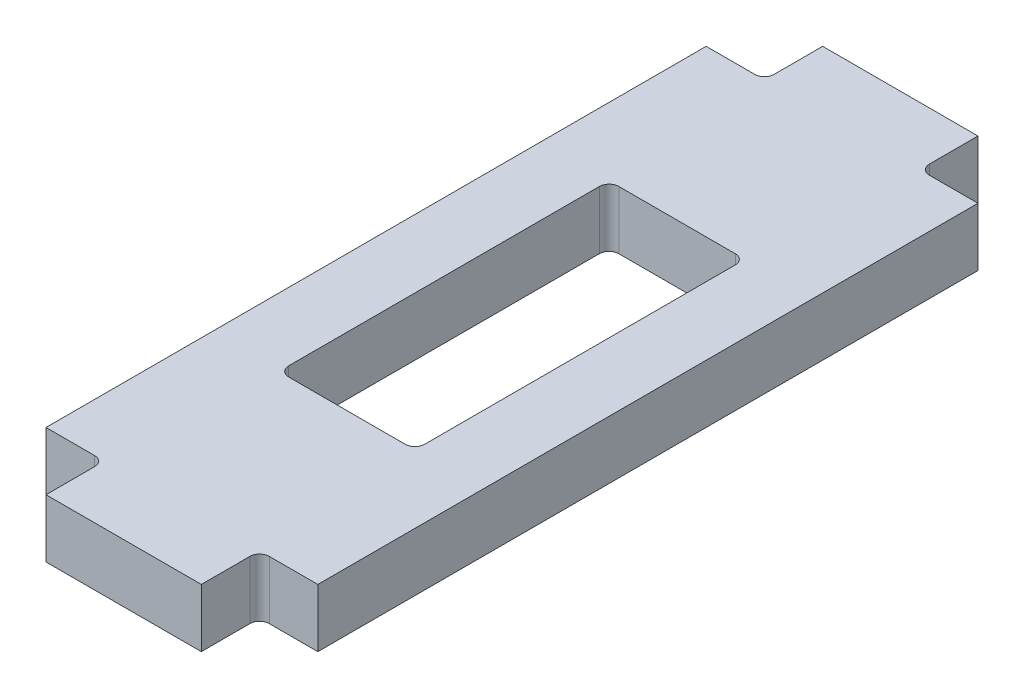
ISO-10303-21;
HEADER;
FILE_DESCRIPTION(('STEP AP214'),'2;1');
FILE_NAME('part.step','',(''),(''),'','','');
FILE_SCHEMA(('AUTOMOTIVE_DESIGN { 1 0 10303 214 1 1 1 1 }'));
ENDSEC;
DATA;
#1=APPLICATION_CONTEXT('core data for automotive mechanical design processes');
#2=APPLICATION_PROTOCOL_DEFINITION('international standard','automotive_design',2000,#1);
#3=PRODUCT_CONTEXT('',#1,'mechanical');
#4=PRODUCT('Part','Part','',(#3));
#5=PRODUCT_RELATED_PRODUCT_CATEGORY('part','',(#4));
#6=PRODUCT_DEFINITION_FORMATION('','',#4);
#7=PRODUCT_DEFINITION_CONTEXT('part definition',#1,'design');
#8=PRODUCT_DEFINITION('design','',#6,#7);
#9=PRODUCT_DEFINITION_SHAPE('','',#8);
#10=(LENGTH_UNIT() NAMED_UNIT(*) SI_UNIT(.MILLI.,.METRE.));
#11=(NAMED_UNIT(*) PLANE_ANGLE_UNIT() SI_UNIT($,.RADIAN.));
#12=(NAMED_UNIT(*) SI_UNIT($,.STERADIAN.) SOLID_ANGLE_UNIT());
#13=UNCERTAINTY_MEASURE_WITH_UNIT(LENGTH_MEASURE(1.E-05),#10,'distance_accuracy_value','');
#14=(GEOMETRIC_REPRESENTATION_CONTEXT(3) GLOBAL_UNCERTAINTY_ASSIGNED_CONTEXT((#13)) GLOBAL_UNIT_ASSIGNED_CONTEXT((#10,
#11,#12)) REPRESENTATION_CONTEXT('',''));
#15=CARTESIAN_POINT('',(0.,0.,0.));
#16=DIRECTION('',(0.,0.,1.));
#17=DIRECTION('',(1.,0.,0.));
#18=AXIS2_PLACEMENT_3D('',#15,#16,#17);
#19=CARTESIAN_POINT('',(0.,3.,-8.5));
#20=DIRECTION('',(0.,0.,-1.));
#21=DIRECTION('',(-1.,0.,0.));
#22=AXIS2_PLACEMENT_3D('',#19,#20,#21);
#23=PLANE('',#22);
#24=DIRECTION('',(1.,0.,0.));
#25=VECTOR('',#24,1.);
#26=CARTESIAN_POINT('',(0.,0.,-8.5));
#27=LINE('',#26,#25);
#28=CARTESIAN_POINT('',(-3.,0.,-8.5));
#29=VERTEX_POINT('',#28);
#30=CARTESIAN_POINT('',(3.,0.,-8.5));
#31=VERTEX_POINT('',#30);
#32=EDGE_CURVE('E289',#29,#31,#27,.T.);
#33=ORIENTED_EDGE('',*,*,#32,.T.);
#34=DIRECTION('',(0.,-1.,0.));
#35=VECTOR('',#34,1.);
#36=CARTESIAN_POINT('',(3.,3.,-8.5));
#37=LINE('',#36,#35);
#38=CARTESIAN_POINT('',(3.,3.,-8.5));
#39=VERTEX_POINT('',#38);
#40=EDGE_CURVE('E333',#31,#39,#37,.F.);
#41=ORIENTED_EDGE('',*,*,#40,.T.);
#42=DIRECTION('',(1.,0.,0.));
#43=VECTOR('',#42,1.);
#44=CARTESIAN_POINT('',(0.,3.,-8.5));
#45=LINE('',#44,#43);
#46=CARTESIAN_POINT('',(-3.,3.,-8.5));
#47=VERTEX_POINT('',#46);
#48=EDGE_CURVE('E251',#47,#39,#45,.T.);
#49=ORIENTED_EDGE('',*,*,#48,.F.);
#50=DIRECTION('',(0.,-1.,0.));
#51=VECTOR('',#50,1.);
#52=CARTESIAN_POINT('',(-3.,3.,-8.5));
#53=LINE('',#52,#51);
#54=EDGE_CURVE('E330',#47,#29,#53,.T.);
#55=ORIENTED_EDGE('',*,*,#54,.T.);
#56=EDGE_LOOP('',(#33,#41,#49,#55));
#57=FACE_BOUND('',#56,.T.);
#58=ADVANCED_FACE('F39',(#57),#23,.F.);
#59=CARTESIAN_POINT('',(3.5,3.,0.));
#60=DIRECTION('',(1.,0.,0.));
#61=DIRECTION('',(0.,0.,-1.));
#62=AXIS2_PLACEMENT_3D('',#59,#60,#61);
#63=PLANE('',#62);
#64=DIRECTION('',(0.,0.,1.));
#65=VECTOR('',#64,1.);
#66=CARTESIAN_POINT('',(3.5,0.,0.));
#67=LINE('',#66,#65);
#68=CARTESIAN_POINT('',(3.5,0.,-8.));
#69=VERTEX_POINT('',#68);
#70=CARTESIAN_POINT('',(3.5,0.,8.));
#71=VERTEX_POINT('',#70);
#72=EDGE_CURVE('E292',#69,#71,#67,.T.);
#73=ORIENTED_EDGE('',*,*,#72,.T.);
#74=DIRECTION('',(0.,-1.,0.));
#75=VECTOR('',#74,1.);
#76=CARTESIAN_POINT('',(3.5,3.,8.));
#77=LINE('',#76,#75);
#78=CARTESIAN_POINT('',(3.5,3.,8.));
#79=VERTEX_POINT('',#78);
#80=EDGE_CURVE('E328',#71,#79,#77,.F.);
#81=ORIENTED_EDGE('',*,*,#80,.T.);
#82=DIRECTION('',(0.,0.,1.));
#83=VECTOR('',#82,1.);
#84=CARTESIAN_POINT('',(3.5,3.,0.));
#85=LINE('',#84,#83);
#86=CARTESIAN_POINT('',(3.5,3.,-8.));
#87=VERTEX_POINT('',#86);
#88=EDGE_CURVE('E254',#87,#79,#85,.T.);
#89=ORIENTED_EDGE('',*,*,#88,.F.);
#90=DIRECTION('',(0.,-1.,0.));
#91=VECTOR('',#90,1.);
#92=CARTESIAN_POINT('',(3.5,0.,-8.));
#93=LINE('',#92,#91);
#94=EDGE_CURVE('E325',#87,#69,#93,.T.);
#95=ORIENTED_EDGE('',*,*,#94,.T.);
#96=EDGE_LOOP('',(#73,#81,#89,#95));
#97=FACE_BOUND('',#96,.T.);
#98=ADVANCED_FACE('F446',(#97),#63,.F.);
#99=CARTESIAN_POINT('',(0.,3.,8.5));
#100=DIRECTION('',(0.,0.,-1.));
#101=DIRECTION('',(-1.,0.,0.));
#102=AXIS2_PLACEMENT_3D('',#99,#100,#101);
#103=PLANE('',#102);
#104=DIRECTION('',(1.,0.,0.));
#105=VECTOR('',#104,1.);
#106=CARTESIAN_POINT('',(0.,0.,8.5));
#107=LINE('',#106,#105);
#108=CARTESIAN_POINT('',(-3.,0.,8.5));
#109=VERTEX_POINT('',#108);
#110=CARTESIAN_POINT('',(3.,0.,8.5));
#111=VERTEX_POINT('',#110);
#112=EDGE_CURVE('E295',#109,#111,#107,.T.);
#113=ORIENTED_EDGE('',*,*,#112,.F.);
#114=DIRECTION('',(0.,-1.,0.));
#115=VECTOR('',#114,1.);
#116=CARTESIAN_POINT('',(-3.,3.,8.5));
#117=LINE('',#116,#115);
#118=CARTESIAN_POINT('',(-3.,3.,8.5));
#119=VERTEX_POINT('',#118);
#120=EDGE_CURVE('E323',#109,#119,#117,.F.);
#121=ORIENTED_EDGE('',*,*,#120,.T.);
#122=DIRECTION('',(1.,0.,0.));
#123=VECTOR('',#122,1.);
#124=CARTESIAN_POINT('',(0.,3.,8.5));
#125=LINE('',#124,#123);
#126=CARTESIAN_POINT('',(3.,3.,8.5));
#127=VERTEX_POINT('',#126);
#128=EDGE_CURVE('E257',#119,#127,#125,.T.);
#129=ORIENTED_EDGE('',*,*,#128,.T.);
#130=DIRECTION('',(0.,-1.,0.));
#131=VECTOR('',#130,1.);
#132=CARTESIAN_POINT('',(3.,3.,8.5));
#133=LINE('',#132,#131);
#134=EDGE_CURVE('E320',#127,#111,#133,.T.);
#135=ORIENTED_EDGE('',*,*,#134,.T.);
#136=EDGE_LOOP('',(#113,#121,#129,#135));
#137=FACE_BOUND('',#136,.T.);
#138=ADVANCED_FACE('F452',(#137),#103,.T.);
#139=CARTESIAN_POINT('',(0.,3.,17.));
#140=DIRECTION('',(0.,0.,-1.));
#141=DIRECTION('',(-1.,0.,0.));
#142=AXIS2_PLACEMENT_3D('',#139,#140,#141);
#143=PLANE('',#142);
#144=DIRECTION('',(1.,0.,0.));
#145=VECTOR('',#144,1.);
#146=CARTESIAN_POINT('',(0.,0.,17.));
#147=LINE('',#146,#145);
#148=CARTESIAN_POINT('',(-6.99999999999999,0.,17.));
#149=VERTEX_POINT('',#148);
#150=CARTESIAN_POINT('',(-4.5,0.,17.));
#151=VERTEX_POINT('',#150);
#152=EDGE_CURVE('E264',#149,#151,#147,.T.);
#153=ORIENTED_EDGE('',*,*,#152,.T.);
#154=DIRECTION('',(0.,-1.,0.));
#155=VECTOR('',#154,1.);
#156=CARTESIAN_POINT('',(-4.5,3.,17.));
#157=LINE('',#156,#155);
#158=CARTESIAN_POINT('',(-4.5,3.,17.));
#159=VERTEX_POINT('',#158);
#160=EDGE_CURVE('E342',#151,#159,#157,.F.);
#161=ORIENTED_EDGE('',*,*,#160,.T.);
#162=DIRECTION('',(1.,0.,0.));
#163=VECTOR('',#162,1.);
#164=CARTESIAN_POINT('',(0.,3.,17.));
#165=LINE('',#164,#163);
#166=CARTESIAN_POINT('',(-6.99999999999999,3.,17.));
#167=VERTEX_POINT('',#166);
#168=EDGE_CURVE('E214',#167,#159,#165,.T.);
#169=ORIENTED_EDGE('',*,*,#168,.F.);
#170=DIRECTION('',(0.,-1.,0.));
#171=VECTOR('',#170,1.);
#172=CARTESIAN_POINT('',(-6.99999999999999,3.,17.));
#173=LINE('',#172,#171);
#174=EDGE_CURVE('E263',#167,#149,#173,.T.);
#175=ORIENTED_EDGE('',*,*,#174,.T.);
#176=EDGE_LOOP('',(#153,#161,#169,#175));
#177=FACE_BOUND('',#176,.T.);
#178=ADVANCED_FACE('F423',(#177),#143,.F.);
#179=CARTESIAN_POINT('',(-4.,3.,0.));
#180=DIRECTION('',(1.,0.,0.));
#181=DIRECTION('',(0.,0.,-1.));
#182=AXIS2_PLACEMENT_3D('',#179,#180,#181);
#183=PLANE('',#182);
#184=DIRECTION('',(0.,0.,1.));
#185=VECTOR('',#184,1.);
#186=CARTESIAN_POINT('',(-4.,3.,0.));
#187=LINE('',#186,#185);
#188=CARTESIAN_POINT('',(-4.,3.,17.5));
#189=VERTEX_POINT('',#188);
#190=CARTESIAN_POINT('',(-4.,3.,20.));
#191=VERTEX_POINT('',#190);
#192=EDGE_CURVE('E200',#189,#191,#187,.T.);
#193=ORIENTED_EDGE('',*,*,#192,.F.);
#194=DIRECTION('',(0.,-1.,0.));
#195=VECTOR('',#194,1.);
#196=CARTESIAN_POINT('',(-4.,0.,17.5));
#197=LINE('',#196,#195);
#198=CARTESIAN_POINT('',(-4.,0.,17.5));
#199=VERTEX_POINT('',#198);
#200=EDGE_CURVE('E340',#189,#199,#197,.T.);
#201=ORIENTED_EDGE('',*,*,#200,.T.);
#202=DIRECTION('',(0.,0.,1.));
#203=VECTOR('',#202,1.);
#204=CARTESIAN_POINT('',(-4.,0.,0.));
#205=LINE('',#204,#203);
#206=CARTESIAN_POINT('',(-4.,0.,20.));
#207=VERTEX_POINT('',#206);
#208=EDGE_CURVE('E220',#199,#207,#205,.T.);
#209=ORIENTED_EDGE('',*,*,#208,.T.);
#210=DIRECTION('',(0.,-1.,0.));
#211=VECTOR('',#210,1.);
#212=CARTESIAN_POINT('',(-4.,3.,20.));
#213=LINE('',#212,#211);
#214=EDGE_CURVE('E217',#191,#207,#213,.T.);
#215=ORIENTED_EDGE('',*,*,#214,.F.);
#216=EDGE_LOOP('',(#193,#201,#209,#215));
#217=FACE_BOUND('',#216,.T.);
#218=ADVANCED_FACE('F218',(#217),#183,.F.);
#219=CARTESIAN_POINT('',(0.,3.,20.));
#220=DIRECTION('',(0.,0.,-1.));
#221=DIRECTION('',(-1.,0.,0.));
#222=AXIS2_PLACEMENT_3D('',#219,#220,#221);
#223=PLANE('',#222);
#224=DIRECTION('',(1.,0.,0.));
#225=VECTOR('',#224,1.);
#226=CARTESIAN_POINT('',(0.,0.,20.));
#227=LINE('',#226,#225);
#228=CARTESIAN_POINT('',(4.,0.,20.));
#229=VERTEX_POINT('',#228);
#230=EDGE_CURVE('E269',#207,#229,#227,.T.);
#231=ORIENTED_EDGE('',*,*,#230,.T.);
#232=DIRECTION('',(0.,-1.,0.));
#233=VECTOR('',#232,1.);
#234=CARTESIAN_POINT('',(4.,3.,20.));
#235=LINE('',#234,#233);
#236=CARTESIAN_POINT('',(4.,3.,20.));
#237=VERTEX_POINT('',#236);
#238=EDGE_CURVE('E225',#237,#229,#235,.T.);
#239=ORIENTED_EDGE('',*,*,#238,.F.);
#240=DIRECTION('',(1.,0.,0.));
#241=VECTOR('',#240,1.);
#242=CARTESIAN_POINT('',(0.,3.,20.));
#243=LINE('',#242,#241);
#244=EDGE_CURVE('E207',#191,#237,#243,.T.);
#245=ORIENTED_EDGE('',*,*,#244,.F.);
#246=ORIENTED_EDGE('',*,*,#214,.T.);
#247=EDGE_LOOP('',(#231,#239,#245,#246));
#248=FACE_BOUND('',#247,.T.);
#249=ADVANCED_FACE('F227',(#248),#223,.F.);
#250=CARTESIAN_POINT('',(4.00000000000001,3.,0.));
#251=DIRECTION('',(1.,0.,0.));
#252=DIRECTION('',(0.,0.,-1.));
#253=AXIS2_PLACEMENT_3D('',#250,#251,#252);
#254=PLANE('',#253);
#255=DIRECTION('',(0.,0.,1.));
#256=VECTOR('',#255,1.);
#257=CARTESIAN_POINT('',(4.00000000000001,0.,0.));
#258=LINE('',#257,#256);
#259=CARTESIAN_POINT('',(4.,0.,17.5));
#260=VERTEX_POINT('',#259);
#261=EDGE_CURVE('E271',#260,#229,#258,.T.);
#262=ORIENTED_EDGE('',*,*,#261,.F.);
#263=DIRECTION('',(0.,-1.,0.));
#264=VECTOR('',#263,1.);
#265=CARTESIAN_POINT('',(4.,3.,17.5));
#266=LINE('',#265,#264);
#267=CARTESIAN_POINT('',(4.,3.,17.5));
#268=VERTEX_POINT('',#267);
#269=EDGE_CURVE('E338',#260,#268,#266,.F.);
#270=ORIENTED_EDGE('',*,*,#269,.T.);
#271=DIRECTION('',(0.,0.,1.));
#272=VECTOR('',#271,1.);
#273=CARTESIAN_POINT('',(4.00000000000001,3.,0.));
#274=LINE('',#273,#272);
#275=EDGE_CURVE('E229',#268,#237,#274,.T.);
#276=ORIENTED_EDGE('',*,*,#275,.T.);
#277=ORIENTED_EDGE('',*,*,#238,.T.);
#278=EDGE_LOOP('',(#262,#270,#276,#277));
#279=FACE_BOUND('',#278,.T.);
#280=ADVANCED_FACE('F413',(#279),#254,.T.);
#281=CARTESIAN_POINT('',(4.5,3.,17.));
#282=VERTEX_POINT('',#281);
#283=CARTESIAN_POINT('',(7.,3.,17.));
#284=VERTEX_POINT('',#283);
#285=EDGE_CURVE('E231',#282,#284,#165,.T.);
#286=ORIENTED_EDGE('',*,*,#285,.F.);
#287=DIRECTION('',(0.,-1.,0.));
#288=VECTOR('',#287,1.);
#289=CARTESIAN_POINT('',(4.5,3.,17.));
#290=LINE('',#289,#288);
#291=CARTESIAN_POINT('',(4.5,0.,17.));
#292=VERTEX_POINT('',#291);
#293=EDGE_CURVE('E335',#282,#292,#290,.T.);
#294=ORIENTED_EDGE('',*,*,#293,.T.);
#295=CARTESIAN_POINT('',(7.,0.,17.));
#296=VERTEX_POINT('',#295);
#297=EDGE_CURVE('E267',#292,#296,#147,.T.);
#298=ORIENTED_EDGE('',*,*,#297,.T.);
#299=DIRECTION('',(0.,-1.,0.));
#300=VECTOR('',#299,1.);
#301=CARTESIAN_POINT('',(7.,3.,17.));
#302=LINE('',#301,#300);
#303=EDGE_CURVE('E312',#284,#296,#302,.T.);
#304=ORIENTED_EDGE('',*,*,#303,.F.);
#305=EDGE_LOOP('',(#286,#294,#298,#304));
#306=FACE_BOUND('',#305,.T.);
#307=ADVANCED_FACE('F406',(#306),#143,.F.);
#308=CARTESIAN_POINT('',(7.,3.,0.));
#309=DIRECTION('',(1.,0.,0.));
#310=DIRECTION('',(0.,0.,-1.));
#311=AXIS2_PLACEMENT_3D('',#308,#309,#310);
#312=PLANE('',#311);
#313=DIRECTION('',(0.,0.,1.));
#314=VECTOR('',#313,1.);
#315=CARTESIAN_POINT('',(7.,0.,0.));
#316=LINE('',#315,#314);
#317=CARTESIAN_POINT('',(7.,0.,-17.));
#318=VERTEX_POINT('',#317);
#319=EDGE_CURVE('E273',#318,#296,#316,.T.);
#320=ORIENTED_EDGE('',*,*,#319,.F.);
#321=DIRECTION('',(0.,-1.,0.));
#322=VECTOR('',#321,1.);
#323=CARTESIAN_POINT('',(7.,3.,-17.));
#324=LINE('',#323,#322);
#325=CARTESIAN_POINT('',(7.,3.,-17.));
#326=VERTEX_POINT('',#325);
#327=EDGE_CURVE('E309',#326,#318,#324,.T.);
#328=ORIENTED_EDGE('',*,*,#327,.F.);
#329=DIRECTION('',(0.,0.,1.));
#330=VECTOR('',#329,1.);
#331=CARTESIAN_POINT('',(7.,3.,0.));
#332=LINE('',#331,#330);
#333=EDGE_CURVE('E235',#326,#284,#332,.T.);
#334=ORIENTED_EDGE('',*,*,#333,.T.);
#335=ORIENTED_EDGE('',*,*,#303,.T.);
#336=EDGE_LOOP('',(#320,#328,#334,#335));
#337=FACE_BOUND('',#336,.T.);
#338=ADVANCED_FACE('F400',(#337),#312,.T.);
#339=CARTESIAN_POINT('',(0.,3.,-17.));
#340=DIRECTION('',(0.,0.,-1.));
#341=DIRECTION('',(-1.,0.,0.));
#342=AXIS2_PLACEMENT_3D('',#339,#340,#341);
#343=PLANE('',#342);
#344=DIRECTION('',(1.,0.,0.));
#345=VECTOR('',#344,1.);
#346=CARTESIAN_POINT('',(0.,0.,-17.));
#347=LINE('',#346,#345);
#348=CARTESIAN_POINT('',(4.5,0.,-17.));
#349=VERTEX_POINT('',#348);
#350=EDGE_CURVE('E276',#349,#318,#347,.T.);
#351=ORIENTED_EDGE('',*,*,#350,.F.);
#352=DIRECTION('',(0.,-1.,0.));
#353=VECTOR('',#352,1.);
#354=CARTESIAN_POINT('',(4.5,3.,-17.));
#355=LINE('',#354,#353);
#356=CARTESIAN_POINT('',(4.5,3.,-17.));
#357=VERTEX_POINT('',#356);
#358=EDGE_CURVE('E347',#349,#357,#355,.F.);
#359=ORIENTED_EDGE('',*,*,#358,.T.);
#360=DIRECTION('',(1.,0.,0.));
#361=VECTOR('',#360,1.);
#362=CARTESIAN_POINT('',(0.,3.,-17.));
#363=LINE('',#362,#361);
#364=EDGE_CURVE('E238',#357,#326,#363,.T.);
#365=ORIENTED_EDGE('',*,*,#364,.T.);
#366=ORIENTED_EDGE('',*,*,#327,.T.);
#367=EDGE_LOOP('',(#351,#359,#365,#366));
#368=FACE_BOUND('',#367,.T.);
#369=ADVANCED_FACE('F396',(#368),#343,.T.);
#370=CARTESIAN_POINT('',(4.,3.,0.));
#371=DIRECTION('',(1.,0.,0.));
#372=DIRECTION('',(0.,0.,-1.));
#373=AXIS2_PLACEMENT_3D('',#370,#371,#372);
#374=PLANE('',#373);
#375=DIRECTION('',(0.,0.,1.));
#376=VECTOR('',#375,1.);
#377=CARTESIAN_POINT('',(4.,3.,0.));
#378=LINE('',#377,#376);
#379=CARTESIAN_POINT('',(4.,3.,-20.));
#380=VERTEX_POINT('',#379);
#381=CARTESIAN_POINT('',(4.,3.,-17.5));
#382=VERTEX_POINT('',#381);
#383=EDGE_CURVE('E240',#380,#382,#378,.T.);
#384=ORIENTED_EDGE('',*,*,#383,.T.);
#385=DIRECTION('',(0.,-1.,0.));
#386=VECTOR('',#385,1.);
#387=CARTESIAN_POINT('',(4.,0.,-17.5));
#388=LINE('',#387,#386);
#389=CARTESIAN_POINT('',(4.,0.,-17.5));
#390=VERTEX_POINT('',#389);
#391=EDGE_CURVE('E344',#382,#390,#388,.T.);
#392=ORIENTED_EDGE('',*,*,#391,.T.);
#393=DIRECTION('',(0.,0.,1.));
#394=VECTOR('',#393,1.);
#395=CARTESIAN_POINT('',(4.,0.,0.));
#396=LINE('',#395,#394);
#397=CARTESIAN_POINT('',(4.,0.,-20.));
#398=VERTEX_POINT('',#397);
#399=EDGE_CURVE('E278',#398,#390,#396,.T.);
#400=ORIENTED_EDGE('',*,*,#399,.F.);
#401=DIRECTION('',(0.,-1.,0.));
#402=VECTOR('',#401,1.);
#403=CARTESIAN_POINT('',(4.,3.,-20.));
#404=LINE('',#403,#402);
#405=EDGE_CURVE('E307',#380,#398,#404,.T.);
#406=ORIENTED_EDGE('',*,*,#405,.F.);
#407=EDGE_LOOP('',(#384,#392,#400,#406));
#408=FACE_BOUND('',#407,.T.);
#409=ADVANCED_FACE('F388',(#408),#374,.T.);
#410=CARTESIAN_POINT('',(0.,3.,-20.));
#411=DIRECTION('',(0.,0.,-1.));
#412=DIRECTION('',(-1.,0.,0.));
#413=AXIS2_PLACEMENT_3D('',#410,#411,#412);
#414=PLANE('',#413);
#415=DIRECTION('',(1.,0.,0.));
#416=VECTOR('',#415,1.);
#417=CARTESIAN_POINT('',(0.,0.,-20.));
#418=LINE('',#417,#416);
#419=CARTESIAN_POINT('',(-4.,0.,-20.));
#420=VERTEX_POINT('',#419);
#421=EDGE_CURVE('E282',#420,#398,#418,.T.);
#422=ORIENTED_EDGE('',*,*,#421,.F.);
#423=DIRECTION('',(0.,-1.,0.));
#424=VECTOR('',#423,1.);
#425=CARTESIAN_POINT('',(-4.,3.,-20.));
#426=LINE('',#425,#424);
#427=CARTESIAN_POINT('',(-4.,3.,-20.));
#428=VERTEX_POINT('',#427);
#429=EDGE_CURVE('E305',#428,#420,#426,.T.);
#430=ORIENTED_EDGE('',*,*,#429,.F.);
#431=DIRECTION('',(1.,0.,0.));
#432=VECTOR('',#431,1.);
#433=CARTESIAN_POINT('',(0.,3.,-20.));
#434=LINE('',#433,#432);
#435=EDGE_CURVE('E244',#428,#380,#434,.T.);
#436=ORIENTED_EDGE('',*,*,#435,.T.);
#437=ORIENTED_EDGE('',*,*,#405,.T.);
#438=EDGE_LOOP('',(#422,#430,#436,#437));
#439=FACE_BOUND('',#438,.T.);
#440=ADVANCED_FACE('F436',(#439),#414,.T.);
#441=CARTESIAN_POINT('',(-4.,3.,0.));
#442=DIRECTION('',(1.,0.,0.));
#443=DIRECTION('',(0.,0.,-1.));
#444=AXIS2_PLACEMENT_3D('',#441,#442,#443);
#445=PLANE('',#444);
#446=DIRECTION('',(0.,0.,1.));
#447=VECTOR('',#446,1.);
#448=CARTESIAN_POINT('',(-4.,0.,0.));
#449=LINE('',#448,#447);
#450=CARTESIAN_POINT('',(-4.,0.,-17.5));
#451=VERTEX_POINT('',#450);
#452=EDGE_CURVE('E285',#420,#451,#449,.T.);
#453=ORIENTED_EDGE('',*,*,#452,.T.);
#454=DIRECTION('',(0.,-1.,0.));
#455=VECTOR('',#454,1.);
#456=CARTESIAN_POINT('',(-4.,3.,-17.5));
#457=LINE('',#456,#455);
#458=CARTESIAN_POINT('',(-4.,3.,-17.5));
#459=VERTEX_POINT('',#458);
#460=EDGE_CURVE('E54',#451,#459,#457,.F.);
#461=ORIENTED_EDGE('',*,*,#460,.T.);
#462=DIRECTION('',(0.,0.,1.));
#463=VECTOR('',#462,1.);
#464=CARTESIAN_POINT('',(-4.,3.,0.));
#465=LINE('',#464,#463);
#466=EDGE_CURVE('E247',#428,#459,#465,.T.);
#467=ORIENTED_EDGE('',*,*,#466,.F.);
#468=ORIENTED_EDGE('',*,*,#429,.T.);
#469=EDGE_LOOP('',(#453,#461,#467,#468));
#470=FACE_BOUND('',#469,.T.);
#471=ADVANCED_FACE('F433',(#470),#445,.F.);
#472=CARTESIAN_POINT('',(-7.,3.,-17.));
#473=VERTEX_POINT('',#472);
#474=CARTESIAN_POINT('',(-4.5,3.,-17.));
#475=VERTEX_POINT('',#474);
#476=EDGE_CURVE('E241',#473,#475,#363,.T.);
#477=ORIENTED_EDGE('',*,*,#476,.T.);
#478=DIRECTION('',(0.,-1.,0.));
#479=VECTOR('',#478,1.);
#480=CARTESIAN_POINT('',(-4.5,3.,-17.));
#481=LINE('',#480,#479);
#482=CARTESIAN_POINT('',(-4.5,0.,-17.));
#483=VERTEX_POINT('',#482);
#484=EDGE_CURVE('E349',#475,#483,#481,.T.);
#485=ORIENTED_EDGE('',*,*,#484,.T.);
#486=CARTESIAN_POINT('',(-7.,0.,-17.));
#487=VERTEX_POINT('',#486);
#488=EDGE_CURVE('E279',#487,#483,#347,.T.);
#489=ORIENTED_EDGE('',*,*,#488,.F.);
#490=DIRECTION('',(0.,-1.,0.));
#491=VECTOR('',#490,1.);
#492=CARTESIAN_POINT('',(-7.,3.,-17.));
#493=LINE('',#492,#491);
#494=EDGE_CURVE('E303',#473,#487,#493,.T.);
#495=ORIENTED_EDGE('',*,*,#494,.F.);
#496=EDGE_LOOP('',(#477,#485,#489,#495));
#497=FACE_BOUND('',#496,.T.);
#498=ADVANCED_FACE('F429',(#497),#343,.T.);
#499=CARTESIAN_POINT('',(-7.,3.,0.));
#500=DIRECTION('',(1.,0.,0.));
#501=DIRECTION('',(0.,0.,-1.));
#502=AXIS2_PLACEMENT_3D('',#499,#500,#501);
#503=PLANE('',#502);
#504=DIRECTION('',(0.,0.,1.));
#505=VECTOR('',#504,1.);
#506=CARTESIAN_POINT('',(-7.,0.,0.));
#507=LINE('',#506,#505);
#508=EDGE_CURVE('E287',#487,#149,#507,.T.);
#509=ORIENTED_EDGE('',*,*,#508,.T.);
#510=ORIENTED_EDGE('',*,*,#174,.F.);
#511=DIRECTION('',(0.,0.,1.));
#512=VECTOR('',#511,1.);
#513=CARTESIAN_POINT('',(-7.,3.,0.));
#514=LINE('',#513,#512);
#515=EDGE_CURVE('E249',#473,#167,#514,.T.);
#516=ORIENTED_EDGE('',*,*,#515,.F.);
#517=ORIENTED_EDGE('',*,*,#494,.T.);
#518=EDGE_LOOP('',(#509,#510,#516,#517));
#519=FACE_BOUND('',#518,.T.);
#520=ADVANCED_FACE('F425',(#519),#503,.F.);
#521=CARTESIAN_POINT('',(-3.5,3.,0.));
#522=DIRECTION('',(1.,0.,0.));
#523=DIRECTION('',(0.,0.,-1.));
#524=AXIS2_PLACEMENT_3D('',#521,#522,#523);
#525=PLANE('',#524);
#526=DIRECTION('',(0.,0.,1.));
#527=VECTOR('',#526,1.);
#528=CARTESIAN_POINT('',(-3.5,3.,0.));
#529=LINE('',#528,#527);
#530=CARTESIAN_POINT('',(-3.5,3.,-8.));
#531=VERTEX_POINT('',#530);
#532=CARTESIAN_POINT('',(-3.5,3.,8.));
#533=VERTEX_POINT('',#532);
#534=EDGE_CURVE('E260',#531,#533,#529,.T.);
#535=ORIENTED_EDGE('',*,*,#534,.T.);
#536=DIRECTION('',(0.,-1.,0.));
#537=VECTOR('',#536,1.);
#538=CARTESIAN_POINT('',(-3.5,0.,8.));
#539=LINE('',#538,#537);
#540=CARTESIAN_POINT('',(-3.5,0.,8.));
#541=VERTEX_POINT('',#540);
#542=EDGE_CURVE('E317',#533,#541,#539,.T.);
#543=ORIENTED_EDGE('',*,*,#542,.T.);
#544=DIRECTION('',(0.,0.,1.));
#545=VECTOR('',#544,1.);
#546=CARTESIAN_POINT('',(-3.5,0.,0.));
#547=LINE('',#546,#545);
#548=CARTESIAN_POINT('',(-3.5,0.,-8.));
#549=VERTEX_POINT('',#548);
#550=EDGE_CURVE('E298',#549,#541,#547,.T.);
#551=ORIENTED_EDGE('',*,*,#550,.F.);
#552=DIRECTION('',(0.,-1.,0.));
#553=VECTOR('',#552,1.);
#554=CARTESIAN_POINT('',(-3.5,3.,-8.));
#555=LINE('',#554,#553);
#556=EDGE_CURVE('E224',#549,#531,#555,.F.);
#557=ORIENTED_EDGE('',*,*,#556,.T.);
#558=EDGE_LOOP('',(#535,#543,#551,#557));
#559=FACE_BOUND('',#558,.T.);
#560=ADVANCED_FACE('F459',(#559),#525,.T.);
#561=CARTESIAN_POINT('',(0.,3.,0.));
#562=DIRECTION('',(0.,1.,0.));
#563=DIRECTION('',(0.,0.,1.));
#564=AXIS2_PLACEMENT_3D('',#561,#562,#563);
#565=PLANE('',#564);
#566=ORIENTED_EDGE('',*,*,#168,.T.);
#567=CARTESIAN_POINT('',(-4.5,3.,17.5));
#568=DIRECTION('',(0.,1.,0.));
#569=DIRECTION('',(0.,0.,1.));
#570=AXIS2_PLACEMENT_3D('',#567,#568,#569);
#571=CIRCLE('',#570,0.5);
#572=EDGE_CURVE('E210',#159,#189,#571,.F.);
#573=ORIENTED_EDGE('',*,*,#572,.T.);
#574=ORIENTED_EDGE('',*,*,#192,.T.);
#575=ORIENTED_EDGE('',*,*,#244,.T.);
#576=ORIENTED_EDGE('',*,*,#275,.F.);
#577=CARTESIAN_POINT('',(4.5,3.,17.5));
#578=DIRECTION('',(0.,1.,0.));
#579=DIRECTION('',(0.,0.,1.));
#580=AXIS2_PLACEMENT_3D('',#577,#578,#579);
#581=CIRCLE('',#580,0.5);
#582=EDGE_CURVE('E371',#268,#282,#581,.F.);
#583=ORIENTED_EDGE('',*,*,#582,.T.);
#584=ORIENTED_EDGE('',*,*,#285,.T.);
#585=ORIENTED_EDGE('',*,*,#333,.F.);
#586=ORIENTED_EDGE('',*,*,#364,.F.);
#587=CARTESIAN_POINT('',(4.5,3.,-17.5));
#588=DIRECTION('',(0.,1.,0.));
#589=DIRECTION('',(0.,0.,1.));
#590=AXIS2_PLACEMENT_3D('',#587,#588,#589);
#591=CIRCLE('',#590,0.5);
#592=EDGE_CURVE('E378',#357,#382,#591,.F.);
#593=ORIENTED_EDGE('',*,*,#592,.T.);
#594=ORIENTED_EDGE('',*,*,#383,.F.);
#595=ORIENTED_EDGE('',*,*,#435,.F.);
#596=ORIENTED_EDGE('',*,*,#466,.T.);
#597=CARTESIAN_POINT('',(-4.5,3.,-17.5));
#598=DIRECTION('',(0.,1.,0.));
#599=DIRECTION('',(0.,0.,1.));
#600=AXIS2_PLACEMENT_3D('',#597,#598,#599);
#601=CIRCLE('',#600,0.5);
#602=EDGE_CURVE('E11',#459,#475,#601,.F.);
#603=ORIENTED_EDGE('',*,*,#602,.T.);
#604=ORIENTED_EDGE('',*,*,#476,.F.);
#605=ORIENTED_EDGE('',*,*,#515,.T.);
#606=EDGE_LOOP('',(#566,#573,#574,#575,#576,#583,#584,#585,#586,#593,#594,#595,#596,#603,#604,#605));
#607=FACE_BOUND('',#606,.T.);
#608=ORIENTED_EDGE('',*,*,#534,.F.);
#609=CARTESIAN_POINT('',(-3.,3.,-8.));
#610=DIRECTION('',(0.,1.,0.));
#611=DIRECTION('',(0.,0.,1.));
#612=AXIS2_PLACEMENT_3D('',#609,#610,#611);
#613=CIRCLE('',#612,0.5);
#614=EDGE_CURVE('E367',#531,#47,#613,.F.);
#615=ORIENTED_EDGE('',*,*,#614,.T.);
#616=ORIENTED_EDGE('',*,*,#48,.T.);
#617=CARTESIAN_POINT('',(3.,3.,-8.));
#618=DIRECTION('',(0.,1.,0.));
#619=DIRECTION('',(0.,0.,1.));
#620=AXIS2_PLACEMENT_3D('',#617,#618,#619);
#621=CIRCLE('',#620,0.5);
#622=EDGE_CURVE('E363',#39,#87,#621,.F.);
#623=ORIENTED_EDGE('',*,*,#622,.T.);
#624=ORIENTED_EDGE('',*,*,#88,.T.);
#625=CARTESIAN_POINT('',(3.,3.,8.));
#626=DIRECTION('',(0.,1.,0.));
#627=DIRECTION('',(0.,0.,1.));
#628=AXIS2_PLACEMENT_3D('',#625,#626,#627);
#629=CIRCLE('',#628,0.5);
#630=EDGE_CURVE('E359',#79,#127,#629,.F.);
#631=ORIENTED_EDGE('',*,*,#630,.T.);
#632=ORIENTED_EDGE('',*,*,#128,.F.);
#633=CARTESIAN_POINT('',(-3.,3.,8.));
#634=DIRECTION('',(0.,1.,0.));
#635=DIRECTION('',(0.,0.,1.));
#636=AXIS2_PLACEMENT_3D('',#633,#634,#635);
#637=CIRCLE('',#636,0.5);
#638=EDGE_CURVE('E355',#119,#533,#637,.F.);
#639=ORIENTED_EDGE('',*,*,#638,.T.);
#640=EDGE_LOOP('',(#608,#615,#616,#623,#624,#631,#632,#639));
#641=FACE_BOUND('',#640,.T.);
#642=ADVANCED_FACE('F203',(#607,#641),#565,.T.);
#643=CARTESIAN_POINT('',(0.,0.,0.));
#644=DIRECTION('',(0.,1.,0.));
#645=DIRECTION('',(0.,0.,1.));
#646=AXIS2_PLACEMENT_3D('',#643,#644,#645);
#647=PLANE('',#646);
#648=ORIENTED_EDGE('',*,*,#152,.F.);
#649=ORIENTED_EDGE('',*,*,#508,.F.);
#650=ORIENTED_EDGE('',*,*,#488,.T.);
#651=CARTESIAN_POINT('',(-4.5,0.,-17.5));
#652=DIRECTION('',(0.,1.,0.));
#653=DIRECTION('',(0.,0.,1.));
#654=AXIS2_PLACEMENT_3D('',#651,#652,#653);
#655=CIRCLE('',#654,0.5);
#656=EDGE_CURVE('E47',#483,#451,#655,.T.);
#657=ORIENTED_EDGE('',*,*,#656,.T.);
#658=ORIENTED_EDGE('',*,*,#452,.F.);
#659=ORIENTED_EDGE('',*,*,#421,.T.);
#660=ORIENTED_EDGE('',*,*,#399,.T.);
#661=CARTESIAN_POINT('',(4.5,0.,-17.5));
#662=DIRECTION('',(0.,1.,0.));
#663=DIRECTION('',(0.,0.,1.));
#664=AXIS2_PLACEMENT_3D('',#661,#662,#663);
#665=CIRCLE('',#664,0.5);
#666=EDGE_CURVE('E376',#390,#349,#665,.T.);
#667=ORIENTED_EDGE('',*,*,#666,.T.);
#668=ORIENTED_EDGE('',*,*,#350,.T.);
#669=ORIENTED_EDGE('',*,*,#319,.T.);
#670=ORIENTED_EDGE('',*,*,#297,.F.);
#671=CARTESIAN_POINT('',(4.5,0.,17.5));
#672=DIRECTION('',(0.,1.,0.));
#673=DIRECTION('',(0.,0.,1.));
#674=AXIS2_PLACEMENT_3D('',#671,#672,#673);
#675=CIRCLE('',#674,0.5);
#676=EDGE_CURVE('E369',#292,#260,#675,.T.);
#677=ORIENTED_EDGE('',*,*,#676,.T.);
#678=ORIENTED_EDGE('',*,*,#261,.T.);
#679=ORIENTED_EDGE('',*,*,#230,.F.);
#680=ORIENTED_EDGE('',*,*,#208,.F.);
#681=CARTESIAN_POINT('',(-4.5,0.,17.5));
#682=DIRECTION('',(0.,1.,0.));
#683=DIRECTION('',(0.,0.,1.));
#684=AXIS2_PLACEMENT_3D('',#681,#682,#683);
#685=CIRCLE('',#684,0.5);
#686=EDGE_CURVE('E373',#199,#151,#685,.T.);
#687=ORIENTED_EDGE('',*,*,#686,.T.);
#688=EDGE_LOOP('',(#648,#649,#650,#657,#658,#659,#660,#667,#668,#669,#670,#677,#678,#679,#680,#687));
#689=FACE_BOUND('',#688,.T.);
#690=ORIENTED_EDGE('',*,*,#32,.F.);
#691=CARTESIAN_POINT('',(-3.,0.,-8.));
#692=DIRECTION('',(0.,1.,0.));
#693=DIRECTION('',(0.,0.,1.));
#694=AXIS2_PLACEMENT_3D('',#691,#692,#693);
#695=CIRCLE('',#694,0.5);
#696=EDGE_CURVE('E365',#29,#549,#695,.T.);
#697=ORIENTED_EDGE('',*,*,#696,.T.);
#698=ORIENTED_EDGE('',*,*,#550,.T.);
#699=CARTESIAN_POINT('',(-3.,0.,8.));
#700=DIRECTION('',(0.,1.,0.));
#701=DIRECTION('',(0.,0.,1.));
#702=AXIS2_PLACEMENT_3D('',#699,#700,#701);
#703=CIRCLE('',#702,0.5);
#704=EDGE_CURVE('E353',#541,#109,#703,.T.);
#705=ORIENTED_EDGE('',*,*,#704,.T.);
#706=ORIENTED_EDGE('',*,*,#112,.T.);
#707=CARTESIAN_POINT('',(3.,0.,8.));
#708=DIRECTION('',(0.,1.,0.));
#709=DIRECTION('',(0.,0.,1.));
#710=AXIS2_PLACEMENT_3D('',#707,#708,#709);
#711=CIRCLE('',#710,0.5);
#712=EDGE_CURVE('E357',#111,#71,#711,.T.);
#713=ORIENTED_EDGE('',*,*,#712,.T.);
#714=ORIENTED_EDGE('',*,*,#72,.F.);
#715=CARTESIAN_POINT('',(3.,0.,-8.));
#716=DIRECTION('',(0.,1.,0.));
#717=DIRECTION('',(0.,0.,1.));
#718=AXIS2_PLACEMENT_3D('',#715,#716,#717);
#719=CIRCLE('',#718,0.5);
#720=EDGE_CURVE('E361',#69,#31,#719,.T.);
#721=ORIENTED_EDGE('',*,*,#720,.T.);
#722=EDGE_LOOP('',(#690,#697,#698,#705,#706,#713,#714,#721));
#723=FACE_BOUND('',#722,.T.);
#724=ADVANCED_FACE('F393',(#689,#723),#647,.F.);
#725=CARTESIAN_POINT('',(-3.,3.,8.));
#726=DIRECTION('',(0.,1.,0.));
#727=DIRECTION('',(0.,0.,1.));
#728=AXIS2_PLACEMENT_3D('',#725,#726,#727);
#729=CYLINDRICAL_SURFACE('',#728,0.5);
#730=ORIENTED_EDGE('',*,*,#638,.F.);
#731=ORIENTED_EDGE('',*,*,#120,.F.);
#732=ORIENTED_EDGE('',*,*,#704,.F.);
#733=ORIENTED_EDGE('',*,*,#542,.F.);
#734=EDGE_LOOP('',(#730,#731,#732,#733));
#735=FACE_BOUND('',#734,.T.);
#736=ADVANCED_FACE('F479',(#735),#729,.F.);
#737=CARTESIAN_POINT('',(3.,3.,8.));
#738=DIRECTION('',(0.,-1.,0.));
#739=DIRECTION('',(0.,0.,-1.));
#740=AXIS2_PLACEMENT_3D('',#737,#738,#739);
#741=CYLINDRICAL_SURFACE('',#740,0.5);
#742=ORIENTED_EDGE('',*,*,#630,.F.);
#743=ORIENTED_EDGE('',*,*,#80,.F.);
#744=ORIENTED_EDGE('',*,*,#712,.F.);
#745=ORIENTED_EDGE('',*,*,#134,.F.);
#746=EDGE_LOOP('',(#742,#743,#744,#745));
#747=FACE_BOUND('',#746,.T.);
#748=ADVANCED_FACE('F482',(#747),#741,.F.);
#749=CARTESIAN_POINT('',(3.,3.,-8.));
#750=DIRECTION('',(0.,1.,0.));
#751=DIRECTION('',(0.,0.,1.));
#752=AXIS2_PLACEMENT_3D('',#749,#750,#751);
#753=CYLINDRICAL_SURFACE('',#752,0.5);
#754=ORIENTED_EDGE('',*,*,#622,.F.);
#755=ORIENTED_EDGE('',*,*,#40,.F.);
#756=ORIENTED_EDGE('',*,*,#720,.F.);
#757=ORIENTED_EDGE('',*,*,#94,.F.);
#758=EDGE_LOOP('',(#754,#755,#756,#757));
#759=FACE_BOUND('',#758,.T.);
#760=ADVANCED_FACE('F486',(#759),#753,.F.);
#761=CARTESIAN_POINT('',(-3.,3.,-8.));
#762=DIRECTION('',(0.,-1.,0.));
#763=DIRECTION('',(0.,0.,-1.));
#764=AXIS2_PLACEMENT_3D('',#761,#762,#763);
#765=CYLINDRICAL_SURFACE('',#764,0.5);
#766=ORIENTED_EDGE('',*,*,#614,.F.);
#767=ORIENTED_EDGE('',*,*,#556,.F.);
#768=ORIENTED_EDGE('',*,*,#696,.F.);
#769=ORIENTED_EDGE('',*,*,#54,.F.);
#770=EDGE_LOOP('',(#766,#767,#768,#769));
#771=FACE_BOUND('',#770,.T.);
#772=ADVANCED_FACE('F490',(#771),#765,.F.);
#773=CARTESIAN_POINT('',(4.5,3.,17.5));
#774=DIRECTION('',(0.,-1.,0.));
#775=DIRECTION('',(0.,0.,-1.));
#776=AXIS2_PLACEMENT_3D('',#773,#774,#775);
#777=CYLINDRICAL_SURFACE('',#776,0.5);
#778=ORIENTED_EDGE('',*,*,#582,.F.);
#779=ORIENTED_EDGE('',*,*,#269,.F.);
#780=ORIENTED_EDGE('',*,*,#676,.F.);
#781=ORIENTED_EDGE('',*,*,#293,.F.);
#782=EDGE_LOOP('',(#778,#779,#780,#781));
#783=FACE_BOUND('',#782,.T.);
#784=ADVANCED_FACE('F410',(#783),#777,.F.);
#785=CARTESIAN_POINT('',(-4.5,3.,17.5));
#786=DIRECTION('',(0.,1.,0.));
#787=DIRECTION('',(0.,0.,1.));
#788=AXIS2_PLACEMENT_3D('',#785,#786,#787);
#789=CYLINDRICAL_SURFACE('',#788,0.5);
#790=ORIENTED_EDGE('',*,*,#572,.F.);
#791=ORIENTED_EDGE('',*,*,#160,.F.);
#792=ORIENTED_EDGE('',*,*,#686,.F.);
#793=ORIENTED_EDGE('',*,*,#200,.F.);
#794=EDGE_LOOP('',(#790,#791,#792,#793));
#795=FACE_BOUND('',#794,.T.);
#796=ADVANCED_FACE('F421',(#795),#789,.F.);
#797=CARTESIAN_POINT('',(4.5,3.,-17.5));
#798=DIRECTION('',(0.,1.,0.));
#799=DIRECTION('',(0.,0.,1.));
#800=AXIS2_PLACEMENT_3D('',#797,#798,#799);
#801=CYLINDRICAL_SURFACE('',#800,0.5);
#802=ORIENTED_EDGE('',*,*,#592,.F.);
#803=ORIENTED_EDGE('',*,*,#358,.F.);
#804=ORIENTED_EDGE('',*,*,#666,.F.);
#805=ORIENTED_EDGE('',*,*,#391,.F.);
#806=EDGE_LOOP('',(#802,#803,#804,#805));
#807=FACE_BOUND('',#806,.T.);
#808=ADVANCED_FACE('F390',(#807),#801,.F.);
#809=CARTESIAN_POINT('',(-4.5,3.,-17.5));
#810=DIRECTION('',(0.,-1.,0.));
#811=DIRECTION('',(0.,0.,-1.));
#812=AXIS2_PLACEMENT_3D('',#809,#810,#811);
#813=CYLINDRICAL_SURFACE('',#812,0.5);
#814=ORIENTED_EDGE('',*,*,#602,.F.);
#815=ORIENTED_EDGE('',*,*,#460,.F.);
#816=ORIENTED_EDGE('',*,*,#656,.F.);
#817=ORIENTED_EDGE('',*,*,#484,.F.);
#818=EDGE_LOOP('',(#814,#815,#816,#817));
#819=FACE_BOUND('',#818,.T.);
#820=ADVANCED_FACE('F41',(#819),#813,.F.);
#821=CLOSED_SHELL('',(#58,#98,#138,#178,#218,#249,#280,#307,#338,#369,#409,#440,#471,#498,#520,
#560,#642,#724,#736,#748,#760,#772,#784,#796,#808,#820));
#822=MANIFOLD_SOLID_BREP('B2',#821);
#823=ADVANCED_BREP_SHAPE_REPRESENTATION('',(#18,#822),#14);
#824=SHAPE_DEFINITION_REPRESENTATION(#9,#823);
ENDSEC;
END-ISO-10303-21;
